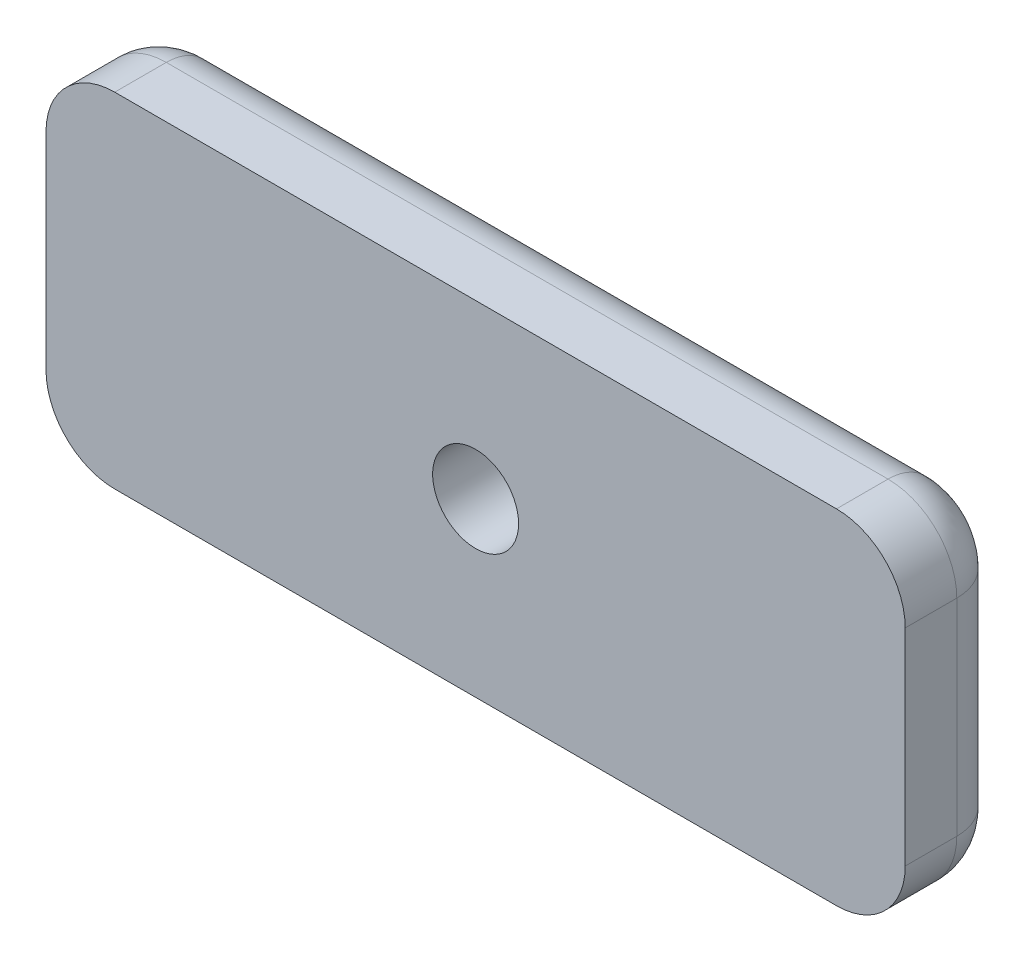
ISO-10303-21;
HEADER;
FILE_DESCRIPTION(('STEP AP214'),'2;1');
FILE_NAME('part.step','',(''),(''),'','','');
FILE_SCHEMA(('AUTOMOTIVE_DESIGN { 1 0 10303 214 1 1 1 1 }'));
ENDSEC;
DATA;
#1=APPLICATION_CONTEXT('core data for automotive mechanical design processes');
#2=APPLICATION_PROTOCOL_DEFINITION('international standard','automotive_design',2000,#1);
#3=PRODUCT_CONTEXT('',#1,'mechanical');
#4=PRODUCT('Part','Part','',(#3));
#5=PRODUCT_RELATED_PRODUCT_CATEGORY('part','',(#4));
#6=PRODUCT_DEFINITION_FORMATION('','',#4);
#7=PRODUCT_DEFINITION_CONTEXT('part definition',#1,'design');
#8=PRODUCT_DEFINITION('design','',#6,#7);
#9=PRODUCT_DEFINITION_SHAPE('','',#8);
#10=(LENGTH_UNIT() NAMED_UNIT(*) SI_UNIT(.MILLI.,.METRE.));
#11=(NAMED_UNIT(*) PLANE_ANGLE_UNIT() SI_UNIT($,.RADIAN.));
#12=(NAMED_UNIT(*) SI_UNIT($,.STERADIAN.) SOLID_ANGLE_UNIT());
#13=UNCERTAINTY_MEASURE_WITH_UNIT(LENGTH_MEASURE(1.E-05),#10,'distance_accuracy_value','');
#14=(GEOMETRIC_REPRESENTATION_CONTEXT(3) GLOBAL_UNCERTAINTY_ASSIGNED_CONTEXT((#13)) GLOBAL_UNIT_ASSIGNED_CONTEXT((#10,
#11,#12)) REPRESENTATION_CONTEXT('',''));
#15=CARTESIAN_POINT('',(0.,0.,0.));
#16=DIRECTION('',(0.,0.,1.));
#17=DIRECTION('',(1.,0.,0.));
#18=AXIS2_PLACEMENT_3D('',#15,#16,#17);
#19=CARTESIAN_POINT('',(21.,7.58418091123838,6.));
#20=DIRECTION('',(0.,0.,-1.));
#21=DIRECTION('',(-1.,0.,0.));
#22=AXIS2_PLACEMENT_3D('',#19,#20,#21);
#23=PLANE('',#22);
#24=CARTESIAN_POINT('',(21.,7.58418091123838,6.));
#25=DIRECTION('',(0.,0.,1.));
#26=DIRECTION('',(-1.,0.,0.));
#27=AXIS2_PLACEMENT_3D('',#24,#25,#26);
#28=CIRCLE('',#27,4.);
#29=CARTESIAN_POINT('',(25.,7.58418091123838,6.));
#30=VERTEX_POINT('',#29);
#31=CARTESIAN_POINT('',(21.,11.5841809112384,6.));
#32=VERTEX_POINT('',#31);
#33=EDGE_CURVE('E133',#30,#32,#28,.T.);
#34=ORIENTED_EDGE('',*,*,#33,.T.);
#35=DIRECTION('',(-1.,0.,0.));
#36=VECTOR('',#35,1.);
#37=CARTESIAN_POINT('',(-21.,11.5841809112384,6.));
#38=LINE('',#37,#36);
#39=CARTESIAN_POINT('',(-21.,11.5841809112384,6.));
#40=VERTEX_POINT('',#39);
#41=EDGE_CURVE('E123',#32,#40,#38,.T.);
#42=ORIENTED_EDGE('',*,*,#41,.T.);
#43=CARTESIAN_POINT('',(-21.,7.58418091123838,6.));
#44=DIRECTION('',(0.,0.,1.));
#45=DIRECTION('',(1.,0.,0.));
#46=AXIS2_PLACEMENT_3D('',#43,#44,#45);
#47=CIRCLE('',#46,4.);
#48=CARTESIAN_POINT('',(-25.,7.58418091123838,6.));
#49=VERTEX_POINT('',#48);
#50=EDGE_CURVE('E132',#40,#49,#47,.T.);
#51=ORIENTED_EDGE('',*,*,#50,.T.);
#52=DIRECTION('',(0.,-1.,0.));
#53=VECTOR('',#52,1.);
#54=CARTESIAN_POINT('',(-25.,7.58418091123838,6.));
#55=LINE('',#54,#53);
#56=CARTESIAN_POINT('',(-25.,-4.41581908876162,6.));
#57=VERTEX_POINT('',#56);
#58=EDGE_CURVE('E212',#49,#57,#55,.T.);
#59=ORIENTED_EDGE('',*,*,#58,.T.);
#60=CARTESIAN_POINT('',(-21.,-4.41581908876162,6.));
#61=DIRECTION('',(0.,0.,1.));
#62=DIRECTION('',(1.,0.,0.));
#63=AXIS2_PLACEMENT_3D('',#60,#61,#62);
#64=CIRCLE('',#63,4.);
#65=CARTESIAN_POINT('',(-21.,-8.41581908876162,6.));
#66=VERTEX_POINT('',#65);
#67=EDGE_CURVE('E214',#57,#66,#64,.T.);
#68=ORIENTED_EDGE('',*,*,#67,.T.);
#69=DIRECTION('',(1.,0.,0.));
#70=VECTOR('',#69,1.);
#71=CARTESIAN_POINT('',(-21.,-8.41581908876162,6.));
#72=LINE('',#71,#70);
#73=CARTESIAN_POINT('',(21.,-8.41581908876162,6.));
#74=VERTEX_POINT('',#73);
#75=EDGE_CURVE('E216',#66,#74,#72,.T.);
#76=ORIENTED_EDGE('',*,*,#75,.T.);
#77=CARTESIAN_POINT('',(21.,-4.41581908876162,6.));
#78=DIRECTION('',(0.,0.,1.));
#79=DIRECTION('',(1.,0.,0.));
#80=AXIS2_PLACEMENT_3D('',#77,#78,#79);
#81=CIRCLE('',#80,4.);
#82=CARTESIAN_POINT('',(25.,-4.41581908876162,6.));
#83=VERTEX_POINT('',#82);
#84=EDGE_CURVE('E218',#74,#83,#81,.T.);
#85=ORIENTED_EDGE('',*,*,#84,.T.);
#86=DIRECTION('',(0.,1.,0.));
#87=VECTOR('',#86,1.);
#88=CARTESIAN_POINT('',(25.,7.58418091123838,6.));
#89=LINE('',#88,#87);
#90=EDGE_CURVE('E138',#83,#30,#89,.T.);
#91=ORIENTED_EDGE('',*,*,#90,.T.);
#92=EDGE_LOOP('',(#34,#42,#51,#59,#68,#76,#85,#91));
#93=FACE_BOUND('',#92,.T.);
#94=CARTESIAN_POINT('',(0.,1.58418091123838,6.));
#95=DIRECTION('',(0.,0.,1.));
#96=DIRECTION('',(1.,0.,0.));
#97=AXIS2_PLACEMENT_3D('',#94,#95,#96);
#98=CIRCLE('',#97,2.5);
#99=CARTESIAN_POINT('',(2.50000000000004,1.58418091123838,6.));
#100=VERTEX_POINT('',#99);
#101=EDGE_CURVE('E139',#100,#100,#98,.T.);
#102=ORIENTED_EDGE('',*,*,#101,.F.);
#103=EDGE_LOOP('',(#102));
#104=FACE_BOUND('',#103,.T.);
#105=ADVANCED_FACE('F33',(#93,#104),#23,.F.);
#106=CARTESIAN_POINT('',(21.,7.58418091123838,0.));
#107=DIRECTION('',(0.,0.,-1.));
#108=DIRECTION('',(-1.,0.,0.));
#109=AXIS2_PLACEMENT_3D('',#106,#107,#108);
#110=PLANE('',#109);
#111=DIRECTION('',(0.,1.,0.));
#112=VECTOR('',#111,1.);
#113=CARTESIAN_POINT('',(22.,-4.41581908876162,0.));
#114=LINE('',#113,#112);
#115=CARTESIAN_POINT('',(22.,7.58418091123838,0.));
#116=VERTEX_POINT('',#115);
#117=CARTESIAN_POINT('',(22.,-4.41581908876162,0.));
#118=VERTEX_POINT('',#117);
#119=EDGE_CURVE('E145',#116,#118,#114,.F.);
#120=ORIENTED_EDGE('',*,*,#119,.T.);
#121=CARTESIAN_POINT('',(21.,-4.41581908876162,0.));
#122=DIRECTION('',(0.,0.,-1.));
#123=DIRECTION('',(-1.,0.,0.));
#124=AXIS2_PLACEMENT_3D('',#121,#122,#123);
#125=CIRCLE('',#124,1.);
#126=CARTESIAN_POINT('',(21.,-5.41581908876162,0.));
#127=VERTEX_POINT('',#126);
#128=EDGE_CURVE('E164',#118,#127,#125,.T.);
#129=ORIENTED_EDGE('',*,*,#128,.T.);
#130=DIRECTION('',(1.,0.,0.));
#131=VECTOR('',#130,1.);
#132=CARTESIAN_POINT('',(-21.,-5.41581908876162,0.));
#133=LINE('',#132,#131);
#134=CARTESIAN_POINT('',(-21.,-5.41581908876162,0.));
#135=VERTEX_POINT('',#134);
#136=EDGE_CURVE('E162',#127,#135,#133,.F.);
#137=ORIENTED_EDGE('',*,*,#136,.T.);
#138=CARTESIAN_POINT('',(-21.,-4.41581908876162,0.));
#139=DIRECTION('',(0.,0.,-1.));
#140=DIRECTION('',(-1.,0.,0.));
#141=AXIS2_PLACEMENT_3D('',#138,#139,#140);
#142=CIRCLE('',#141,1.);
#143=CARTESIAN_POINT('',(-22.,-4.41581908876162,0.));
#144=VERTEX_POINT('',#143);
#145=EDGE_CURVE('E160',#135,#144,#142,.T.);
#146=ORIENTED_EDGE('',*,*,#145,.T.);
#147=DIRECTION('',(0.,-1.,0.));
#148=VECTOR('',#147,1.);
#149=CARTESIAN_POINT('',(-22.,7.58418091123838,0.));
#150=LINE('',#149,#148);
#151=CARTESIAN_POINT('',(-22.,7.58418091123838,0.));
#152=VERTEX_POINT('',#151);
#153=EDGE_CURVE('E158',#144,#152,#150,.F.);
#154=ORIENTED_EDGE('',*,*,#153,.T.);
#155=CARTESIAN_POINT('',(-21.,7.58418091123838,0.));
#156=DIRECTION('',(0.,0.,-1.));
#157=DIRECTION('',(-1.,0.,0.));
#158=AXIS2_PLACEMENT_3D('',#155,#156,#157);
#159=CIRCLE('',#158,0.999999999999999);
#160=CARTESIAN_POINT('',(-21.,8.58418091123838,0.));
#161=VERTEX_POINT('',#160);
#162=EDGE_CURVE('E156',#152,#161,#159,.T.);
#163=ORIENTED_EDGE('',*,*,#162,.T.);
#164=DIRECTION('',(-1.,0.,0.));
#165=VECTOR('',#164,1.);
#166=CARTESIAN_POINT('',(21.,8.58418091123838,0.));
#167=LINE('',#166,#165);
#168=CARTESIAN_POINT('',(21.,8.58418091123838,0.));
#169=VERTEX_POINT('',#168);
#170=EDGE_CURVE('E154',#161,#169,#167,.F.);
#171=ORIENTED_EDGE('',*,*,#170,.T.);
#172=CARTESIAN_POINT('',(21.,7.58418091123838,0.));
#173=DIRECTION('',(0.,0.,-1.));
#174=DIRECTION('',(-1.,0.,0.));
#175=AXIS2_PLACEMENT_3D('',#172,#173,#174);
#176=CIRCLE('',#175,0.999999999999998);
#177=EDGE_CURVE('E152',#169,#116,#176,.T.);
#178=ORIENTED_EDGE('',*,*,#177,.T.);
#179=EDGE_LOOP('',(#120,#129,#137,#146,#154,#163,#171,#178));
#180=FACE_BOUND('',#179,.T.);
#181=CARTESIAN_POINT('',(0.,1.58418091123838,0.));
#182=DIRECTION('',(0.,0.,1.));
#183=DIRECTION('',(1.,0.,0.));
#184=AXIS2_PLACEMENT_3D('',#181,#182,#183);
#185=CIRCLE('',#184,2.5);
#186=CARTESIAN_POINT('',(2.50000000000004,1.58418091123838,0.));
#187=VERTEX_POINT('',#186);
#188=EDGE_CURVE('E199',#187,#187,#185,.T.);
#189=ORIENTED_EDGE('',*,*,#188,.T.);
#190=EDGE_LOOP('',(#189));
#191=FACE_BOUND('',#190,.T.);
#192=ADVANCED_FACE('F271',(#180,#191),#110,.T.);
#193=CARTESIAN_POINT('',(21.,7.58418091123838,6.));
#194=DIRECTION('',(0.,0.,-1.));
#195=DIRECTION('',(-1.,0.,0.));
#196=AXIS2_PLACEMENT_3D('',#193,#194,#195);
#197=CYLINDRICAL_SURFACE('',#196,4.);
#198=DIRECTION('',(0.,0.,-1.));
#199=VECTOR('',#198,1.);
#200=CARTESIAN_POINT('',(25.,7.58418091123838,6.));
#201=LINE('',#200,#199);
#202=CARTESIAN_POINT('',(25.,7.58418091123838,3.));
#203=VERTEX_POINT('',#202);
#204=EDGE_CURVE('E221',#30,#203,#201,.T.);
#205=ORIENTED_EDGE('',*,*,#204,.T.);
#206=CARTESIAN_POINT('',(21.,7.58418091123838,3.));
#207=DIRECTION('',(0.,0.,-1.));
#208=DIRECTION('',(-1.,0.,0.));
#209=AXIS2_PLACEMENT_3D('',#206,#207,#208);
#210=CIRCLE('',#209,4.);
#211=CARTESIAN_POINT('',(21.,11.5841809112384,3.));
#212=VERTEX_POINT('',#211);
#213=EDGE_CURVE('E42',#203,#212,#210,.F.);
#214=ORIENTED_EDGE('',*,*,#213,.T.);
#215=DIRECTION('',(0.,0.,-1.));
#216=VECTOR('',#215,1.);
#217=CARTESIAN_POINT('',(21.,11.5841809112384,6.));
#218=LINE('',#217,#216);
#219=EDGE_CURVE('E126',#32,#212,#218,.T.);
#220=ORIENTED_EDGE('',*,*,#219,.F.);
#221=ORIENTED_EDGE('',*,*,#33,.F.);
#222=EDGE_LOOP('',(#205,#214,#220,#221));
#223=FACE_BOUND('',#222,.T.);
#224=ADVANCED_FACE('F141',(#223),#197,.T.);
#225=CARTESIAN_POINT('',(-21.,11.5841809112384,6.));
#226=DIRECTION('',(0.,-1.,0.));
#227=DIRECTION('',(1.,0.,0.));
#228=AXIS2_PLACEMENT_3D('',#225,#226,#227);
#229=PLANE('',#228);
#230=ORIENTED_EDGE('',*,*,#219,.T.);
#231=DIRECTION('',(-1.,0.,0.));
#232=VECTOR('',#231,1.);
#233=CARTESIAN_POINT('',(-21.,11.5841809112384,3.));
#234=LINE('',#233,#232);
#235=CARTESIAN_POINT('',(-21.,11.5841809112384,3.));
#236=VERTEX_POINT('',#235);
#237=EDGE_CURVE('E175',#212,#236,#234,.T.);
#238=ORIENTED_EDGE('',*,*,#237,.T.);
#239=DIRECTION('',(0.,0.,-1.));
#240=VECTOR('',#239,1.);
#241=CARTESIAN_POINT('',(-21.,11.5841809112384,6.));
#242=LINE('',#241,#240);
#243=EDGE_CURVE('E129',#40,#236,#242,.T.);
#244=ORIENTED_EDGE('',*,*,#243,.F.);
#245=ORIENTED_EDGE('',*,*,#41,.F.);
#246=EDGE_LOOP('',(#230,#238,#244,#245));
#247=FACE_BOUND('',#246,.T.);
#248=ADVANCED_FACE('F125',(#247),#229,.F.);
#249=CARTESIAN_POINT('',(-21.,7.58418091123838,6.));
#250=DIRECTION('',(0.,0.,-1.));
#251=DIRECTION('',(-1.,0.,0.));
#252=AXIS2_PLACEMENT_3D('',#249,#250,#251);
#253=CYLINDRICAL_SURFACE('',#252,4.);
#254=ORIENTED_EDGE('',*,*,#243,.T.);
#255=CARTESIAN_POINT('',(-21.,7.58418091123838,3.));
#256=DIRECTION('',(0.,0.,-1.));
#257=DIRECTION('',(-1.,0.,0.));
#258=AXIS2_PLACEMENT_3D('',#255,#256,#257);
#259=CIRCLE('',#258,4.);
#260=CARTESIAN_POINT('',(-25.,7.58418091123838,3.));
#261=VERTEX_POINT('',#260);
#262=EDGE_CURVE('E173',#236,#261,#259,.F.);
#263=ORIENTED_EDGE('',*,*,#262,.T.);
#264=DIRECTION('',(0.,0.,-1.));
#265=VECTOR('',#264,1.);
#266=CARTESIAN_POINT('',(-25.,7.58418091123838,6.));
#267=LINE('',#266,#265);
#268=EDGE_CURVE('E147',#49,#261,#267,.T.);
#269=ORIENTED_EDGE('',*,*,#268,.F.);
#270=ORIENTED_EDGE('',*,*,#50,.F.);
#271=EDGE_LOOP('',(#254,#263,#269,#270));
#272=FACE_BOUND('',#271,.T.);
#273=ADVANCED_FACE('F261',(#272),#253,.T.);
#274=CARTESIAN_POINT('',(-25.,7.58418091123838,6.));
#275=DIRECTION('',(1.,0.,0.));
#276=DIRECTION('',(0.,0.,-1.));
#277=AXIS2_PLACEMENT_3D('',#274,#275,#276);
#278=PLANE('',#277);
#279=ORIENTED_EDGE('',*,*,#268,.T.);
#280=DIRECTION('',(0.,-1.,0.));
#281=VECTOR('',#280,1.);
#282=CARTESIAN_POINT('',(-25.,-4.41581908876162,3.));
#283=LINE('',#282,#281);
#284=CARTESIAN_POINT('',(-25.,-4.41581908876162,3.));
#285=VERTEX_POINT('',#284);
#286=EDGE_CURVE('E171',#261,#285,#283,.T.);
#287=ORIENTED_EDGE('',*,*,#286,.T.);
#288=DIRECTION('',(0.,0.,-1.));
#289=VECTOR('',#288,1.);
#290=CARTESIAN_POINT('',(-25.,-4.41581908876162,6.));
#291=LINE('',#290,#289);
#292=EDGE_CURVE('E231',#57,#285,#291,.T.);
#293=ORIENTED_EDGE('',*,*,#292,.F.);
#294=ORIENTED_EDGE('',*,*,#58,.F.);
#295=EDGE_LOOP('',(#279,#287,#293,#294));
#296=FACE_BOUND('',#295,.T.);
#297=ADVANCED_FACE('F237',(#296),#278,.F.);
#298=CARTESIAN_POINT('',(-21.,-4.41581908876162,6.));
#299=DIRECTION('',(0.,0.,-1.));
#300=DIRECTION('',(-1.,0.,0.));
#301=AXIS2_PLACEMENT_3D('',#298,#299,#300);
#302=CYLINDRICAL_SURFACE('',#301,4.);
#303=ORIENTED_EDGE('',*,*,#292,.T.);
#304=CARTESIAN_POINT('',(-21.,-4.41581908876162,3.));
#305=DIRECTION('',(0.,0.,-1.));
#306=DIRECTION('',(-1.,0.,0.));
#307=AXIS2_PLACEMENT_3D('',#304,#305,#306);
#308=CIRCLE('',#307,4.);
#309=CARTESIAN_POINT('',(-21.,-8.41581908876162,3.));
#310=VERTEX_POINT('',#309);
#311=EDGE_CURVE('E169',#285,#310,#308,.F.);
#312=ORIENTED_EDGE('',*,*,#311,.T.);
#313=DIRECTION('',(0.,0.,-1.));
#314=VECTOR('',#313,1.);
#315=CARTESIAN_POINT('',(-21.,-8.41581908876162,6.));
#316=LINE('',#315,#314);
#317=EDGE_CURVE('E228',#66,#310,#316,.T.);
#318=ORIENTED_EDGE('',*,*,#317,.F.);
#319=ORIENTED_EDGE('',*,*,#67,.F.);
#320=EDGE_LOOP('',(#303,#312,#318,#319));
#321=FACE_BOUND('',#320,.T.);
#322=ADVANCED_FACE('F253',(#321),#302,.T.);
#323=CARTESIAN_POINT('',(-21.,-8.41581908876162,6.));
#324=DIRECTION('',(0.,1.,0.));
#325=DIRECTION('',(0.,0.,1.));
#326=AXIS2_PLACEMENT_3D('',#323,#324,#325);
#327=PLANE('',#326);
#328=ORIENTED_EDGE('',*,*,#317,.T.);
#329=DIRECTION('',(1.,0.,0.));
#330=VECTOR('',#329,1.);
#331=CARTESIAN_POINT('',(21.,-8.41581908876162,3.));
#332=LINE('',#331,#330);
#333=CARTESIAN_POINT('',(21.,-8.41581908876162,3.));
#334=VERTEX_POINT('',#333);
#335=EDGE_CURVE('E167',#310,#334,#332,.T.);
#336=ORIENTED_EDGE('',*,*,#335,.T.);
#337=DIRECTION('',(0.,0.,-1.));
#338=VECTOR('',#337,1.);
#339=CARTESIAN_POINT('',(21.,-8.41581908876162,6.));
#340=LINE('',#339,#338);
#341=EDGE_CURVE('E225',#74,#334,#340,.T.);
#342=ORIENTED_EDGE('',*,*,#341,.F.);
#343=ORIENTED_EDGE('',*,*,#75,.F.);
#344=EDGE_LOOP('',(#328,#336,#342,#343));
#345=FACE_BOUND('',#344,.T.);
#346=ADVANCED_FACE('F257',(#345),#327,.F.);
#347=CARTESIAN_POINT('',(21.,-4.41581908876162,6.));
#348=DIRECTION('',(0.,0.,-1.));
#349=DIRECTION('',(-1.,0.,0.));
#350=AXIS2_PLACEMENT_3D('',#347,#348,#349);
#351=CYLINDRICAL_SURFACE('',#350,4.);
#352=ORIENTED_EDGE('',*,*,#341,.T.);
#353=CARTESIAN_POINT('',(21.,-4.41581908876162,3.));
#354=DIRECTION('',(0.,0.,-1.));
#355=DIRECTION('',(-1.,0.,0.));
#356=AXIS2_PLACEMENT_3D('',#353,#354,#355);
#357=CIRCLE('',#356,4.);
#358=CARTESIAN_POINT('',(25.,-4.41581908876162,3.));
#359=VERTEX_POINT('',#358);
#360=EDGE_CURVE('E142',#334,#359,#357,.F.);
#361=ORIENTED_EDGE('',*,*,#360,.T.);
#362=DIRECTION('',(0.,0.,-1.));
#363=VECTOR('',#362,1.);
#364=CARTESIAN_POINT('',(25.,-4.41581908876162,6.));
#365=LINE('',#364,#363);
#366=EDGE_CURVE('E223',#83,#359,#365,.T.);
#367=ORIENTED_EDGE('',*,*,#366,.F.);
#368=ORIENTED_EDGE('',*,*,#84,.F.);
#369=EDGE_LOOP('',(#352,#361,#367,#368));
#370=FACE_BOUND('',#369,.T.);
#371=ADVANCED_FACE('F284',(#370),#351,.T.);
#372=CARTESIAN_POINT('',(25.,7.58418091123838,6.));
#373=DIRECTION('',(-1.,0.,0.));
#374=DIRECTION('',(0.,0.,1.));
#375=AXIS2_PLACEMENT_3D('',#372,#373,#374);
#376=PLANE('',#375);
#377=ORIENTED_EDGE('',*,*,#366,.T.);
#378=DIRECTION('',(0.,1.,0.));
#379=VECTOR('',#378,1.);
#380=CARTESIAN_POINT('',(25.,7.58418091123838,3.));
#381=LINE('',#380,#379);
#382=EDGE_CURVE('E11',#359,#203,#381,.T.);
#383=ORIENTED_EDGE('',*,*,#382,.T.);
#384=ORIENTED_EDGE('',*,*,#204,.F.);
#385=ORIENTED_EDGE('',*,*,#90,.F.);
#386=EDGE_LOOP('',(#377,#383,#384,#385));
#387=FACE_BOUND('',#386,.T.);
#388=ADVANCED_FACE('F281',(#387),#376,.F.);
#389=CARTESIAN_POINT('',(0.,1.58418091123838,6.));
#390=DIRECTION('',(0.,0.,-1.));
#391=DIRECTION('',(-1.,0.,0.));
#392=AXIS2_PLACEMENT_3D('',#389,#390,#391);
#393=CYLINDRICAL_SURFACE('',#392,2.5);
#394=ORIENTED_EDGE('',*,*,#101,.T.);
#395=EDGE_LOOP('',(#394));
#396=FACE_BOUND('',#395,.T.);
#397=ORIENTED_EDGE('',*,*,#188,.F.);
#398=EDGE_LOOP('',(#397));
#399=FACE_BOUND('',#398,.T.);
#400=ADVANCED_FACE('F279',(#396,#399),#393,.F.);
#401=CARTESIAN_POINT('',(-21.,7.58418091123838,3.));
#402=DIRECTION('',(0.,0.,-1.));
#403=DIRECTION('',(-1.,0.,0.));
#404=AXIS2_PLACEMENT_3D('',#401,#402,#403);
#405=DEGENERATE_TOROIDAL_SURFACE('',#404,0.999999999999999,3.,.T.);
#406=CARTESIAN_POINT('',(-21.,8.58418091123838,3.));
#407=DIRECTION('',(1.,0.,0.));
#408=DIRECTION('',(0.,0.,-1.));
#409=AXIS2_PLACEMENT_3D('',#406,#407,#408);
#410=CIRCLE('',#409,3.);
#411=EDGE_CURVE('E193',#161,#236,#410,.T.);
#412=ORIENTED_EDGE('',*,*,#411,.F.);
#413=ORIENTED_EDGE('',*,*,#162,.F.);
#414=CARTESIAN_POINT('',(-22.,7.58418091123838,3.));
#415=DIRECTION('',(0.,-1.,0.));
#416=DIRECTION('',(1.,0.,0.));
#417=AXIS2_PLACEMENT_3D('',#414,#415,#416);
#418=CIRCLE('',#417,3.);
#419=EDGE_CURVE('E37',#261,#152,#418,.T.);
#420=ORIENTED_EDGE('',*,*,#419,.F.);
#421=ORIENTED_EDGE('',*,*,#262,.F.);
#422=EDGE_LOOP('',(#412,#413,#420,#421));
#423=FACE_BOUND('',#422,.T.);
#424=ADVANCED_FACE('F35',(#423),#405,.T.);
#425=CARTESIAN_POINT('',(-22.,7.58418091123838,3.));
#426=DIRECTION('',(0.,1.,0.));
#427=DIRECTION('',(0.,0.,1.));
#428=AXIS2_PLACEMENT_3D('',#425,#426,#427);
#429=CYLINDRICAL_SURFACE('',#428,3.);
#430=ORIENTED_EDGE('',*,*,#419,.T.);
#431=ORIENTED_EDGE('',*,*,#153,.F.);
#432=CARTESIAN_POINT('',(-22.,-4.41581908876162,3.));
#433=DIRECTION('',(0.,-1.,0.));
#434=DIRECTION('',(0.,0.,-1.));
#435=AXIS2_PLACEMENT_3D('',#432,#433,#434);
#436=CIRCLE('',#435,3.);
#437=EDGE_CURVE('E191',#285,#144,#436,.T.);
#438=ORIENTED_EDGE('',*,*,#437,.F.);
#439=ORIENTED_EDGE('',*,*,#286,.F.);
#440=EDGE_LOOP('',(#430,#431,#438,#439));
#441=FACE_BOUND('',#440,.T.);
#442=ADVANCED_FACE('F244',(#441),#429,.T.);
#443=CARTESIAN_POINT('',(-21.,8.58418091123838,3.));
#444=DIRECTION('',(1.,0.,0.));
#445=DIRECTION('',(0.,1.,0.));
#446=AXIS2_PLACEMENT_3D('',#443,#444,#445);
#447=CYLINDRICAL_SURFACE('',#446,3.);
#448=ORIENTED_EDGE('',*,*,#411,.T.);
#449=ORIENTED_EDGE('',*,*,#237,.F.);
#450=CARTESIAN_POINT('',(21.,8.58418091123838,3.));
#451=DIRECTION('',(1.,0.,0.));
#452=DIRECTION('',(0.,0.,-1.));
#453=AXIS2_PLACEMENT_3D('',#450,#451,#452);
#454=CIRCLE('',#453,3.);
#455=EDGE_CURVE('E188',#169,#212,#454,.T.);
#456=ORIENTED_EDGE('',*,*,#455,.F.);
#457=ORIENTED_EDGE('',*,*,#170,.F.);
#458=EDGE_LOOP('',(#448,#449,#456,#457));
#459=FACE_BOUND('',#458,.T.);
#460=ADVANCED_FACE('F325',(#459),#447,.T.);
#461=CARTESIAN_POINT('',(-21.,-4.41581908876162,3.));
#462=DIRECTION('',(0.,0.,-1.));
#463=DIRECTION('',(-1.,0.,0.));
#464=AXIS2_PLACEMENT_3D('',#461,#462,#463);
#465=DEGENERATE_TOROIDAL_SURFACE('',#464,1.,3.,.T.);
#466=ORIENTED_EDGE('',*,*,#437,.T.);
#467=ORIENTED_EDGE('',*,*,#145,.F.);
#468=CARTESIAN_POINT('',(-21.,-5.41581908876162,3.));
#469=DIRECTION('',(1.,0.,0.));
#470=DIRECTION('',(0.,0.,-1.));
#471=AXIS2_PLACEMENT_3D('',#468,#469,#470);
#472=CIRCLE('',#471,3.);
#473=EDGE_CURVE('E185',#310,#135,#472,.T.);
#474=ORIENTED_EDGE('',*,*,#473,.F.);
#475=ORIENTED_EDGE('',*,*,#311,.F.);
#476=EDGE_LOOP('',(#466,#467,#474,#475));
#477=FACE_BOUND('',#476,.T.);
#478=ADVANCED_FACE('F249',(#477),#465,.T.);
#479=CARTESIAN_POINT('',(21.,7.58418091123838,3.));
#480=DIRECTION('',(0.,0.,-1.));
#481=DIRECTION('',(-1.,0.,0.));
#482=AXIS2_PLACEMENT_3D('',#479,#480,#481);
#483=DEGENERATE_TOROIDAL_SURFACE('',#482,0.999999999999998,3.,.T.);
#484=ORIENTED_EDGE('',*,*,#455,.T.);
#485=ORIENTED_EDGE('',*,*,#213,.F.);
#486=CARTESIAN_POINT('',(22.,7.58418091123838,3.));
#487=DIRECTION('',(0.,-1.,0.));
#488=DIRECTION('',(1.,0.,0.));
#489=AXIS2_PLACEMENT_3D('',#486,#487,#488);
#490=CIRCLE('',#489,3.);
#491=EDGE_CURVE('E182',#116,#203,#490,.T.);
#492=ORIENTED_EDGE('',*,*,#491,.F.);
#493=ORIENTED_EDGE('',*,*,#177,.F.);
#494=EDGE_LOOP('',(#484,#485,#492,#493));
#495=FACE_BOUND('',#494,.T.);
#496=ADVANCED_FACE('F337',(#495),#483,.T.);
#497=CARTESIAN_POINT('',(-21.,-5.41581908876162,3.));
#498=DIRECTION('',(-1.,0.,0.));
#499=DIRECTION('',(0.,0.,1.));
#500=AXIS2_PLACEMENT_3D('',#497,#498,#499);
#501=CYLINDRICAL_SURFACE('',#500,3.);
#502=ORIENTED_EDGE('',*,*,#473,.T.);
#503=ORIENTED_EDGE('',*,*,#136,.F.);
#504=CARTESIAN_POINT('',(21.,-5.41581908876162,3.));
#505=DIRECTION('',(1.,0.,0.));
#506=DIRECTION('',(0.,0.,-1.));
#507=AXIS2_PLACEMENT_3D('',#504,#505,#506);
#508=CIRCLE('',#507,3.);
#509=EDGE_CURVE('E180',#334,#127,#508,.T.);
#510=ORIENTED_EDGE('',*,*,#509,.F.);
#511=ORIENTED_EDGE('',*,*,#335,.F.);
#512=EDGE_LOOP('',(#502,#503,#510,#511));
#513=FACE_BOUND('',#512,.T.);
#514=ADVANCED_FACE('F344',(#513),#501,.T.);
#515=CARTESIAN_POINT('',(22.,7.58418091123838,3.));
#516=DIRECTION('',(0.,-1.,0.));
#517=DIRECTION('',(0.,0.,-1.));
#518=AXIS2_PLACEMENT_3D('',#515,#516,#517);
#519=CYLINDRICAL_SURFACE('',#518,3.);
#520=ORIENTED_EDGE('',*,*,#491,.T.);
#521=ORIENTED_EDGE('',*,*,#382,.F.);
#522=CARTESIAN_POINT('',(22.,-4.41581908876162,3.));
#523=DIRECTION('',(0.,-1.,0.));
#524=DIRECTION('',(0.,0.,-1.));
#525=AXIS2_PLACEMENT_3D('',#522,#523,#524);
#526=CIRCLE('',#525,3.);
#527=EDGE_CURVE('E178',#118,#359,#526,.T.);
#528=ORIENTED_EDGE('',*,*,#527,.F.);
#529=ORIENTED_EDGE('',*,*,#119,.F.);
#530=EDGE_LOOP('',(#520,#521,#528,#529));
#531=FACE_BOUND('',#530,.T.);
#532=ADVANCED_FACE('F352',(#531),#519,.T.);
#533=CARTESIAN_POINT('',(21.,-4.41581908876162,3.));
#534=DIRECTION('',(0.,0.,-1.));
#535=DIRECTION('',(-1.,0.,0.));
#536=AXIS2_PLACEMENT_3D('',#533,#534,#535);
#537=DEGENERATE_TOROIDAL_SURFACE('',#536,1.,3.,.T.);
#538=ORIENTED_EDGE('',*,*,#509,.T.);
#539=ORIENTED_EDGE('',*,*,#128,.F.);
#540=ORIENTED_EDGE('',*,*,#527,.T.);
#541=ORIENTED_EDGE('',*,*,#360,.F.);
#542=EDGE_LOOP('',(#538,#539,#540,#541));
#543=FACE_BOUND('',#542,.T.);
#544=ADVANCED_FACE('F360',(#543),#537,.T.);
#545=CLOSED_SHELL('',(#105,#192,#224,#248,#273,#297,#322,#346,#371,#388,#400,#424,#442,#460,
#478,#496,#514,#532,#544));
#546=MANIFOLD_SOLID_BREP('B2',#545);
#547=ADVANCED_BREP_SHAPE_REPRESENTATION('',(#18,#546),#14);
#548=SHAPE_DEFINITION_REPRESENTATION(#9,#547);
ENDSEC;
END-ISO-10303-21;
